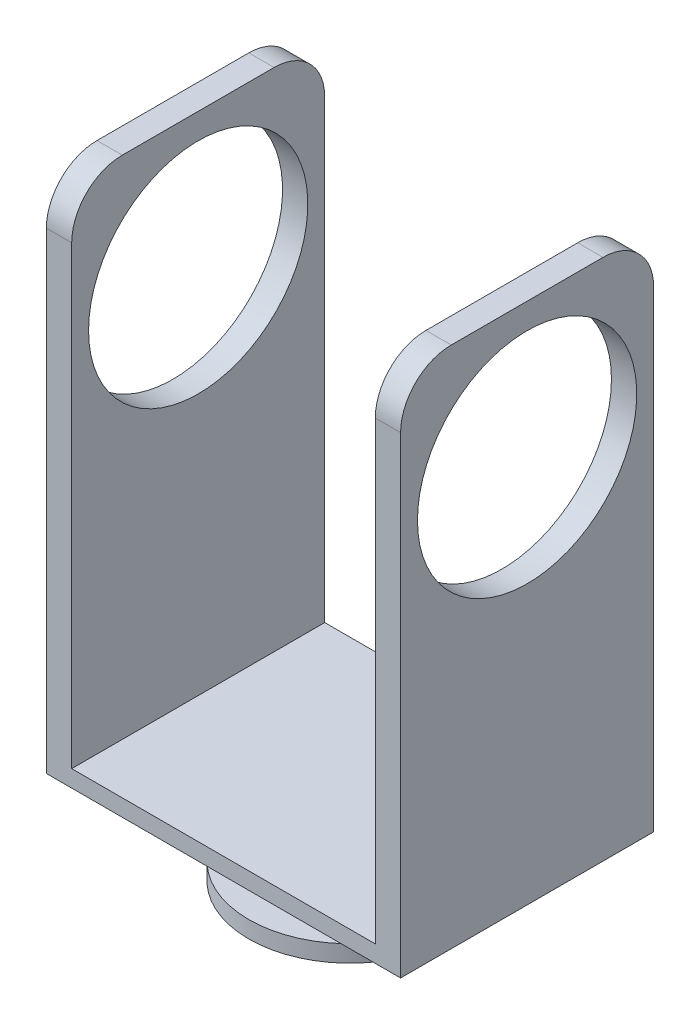
ISO-10303-21;
HEADER;
FILE_DESCRIPTION(('STEP AP214'),'2;1');
FILE_NAME('part.step','',(''),(''),'','','');
FILE_SCHEMA(('AUTOMOTIVE_DESIGN { 1 0 10303 214 1 1 1 1 }'));
ENDSEC;
DATA;
#1=APPLICATION_CONTEXT('core data for automotive mechanical design processes');
#2=APPLICATION_PROTOCOL_DEFINITION('international standard','automotive_design',2000,#1);
#3=PRODUCT_CONTEXT('',#1,'mechanical');
#4=PRODUCT('Part','Part','',(#3));
#5=PRODUCT_RELATED_PRODUCT_CATEGORY('part','',(#4));
#6=PRODUCT_DEFINITION_FORMATION('','',#4);
#7=PRODUCT_DEFINITION_CONTEXT('part definition',#1,'design');
#8=PRODUCT_DEFINITION('design','',#6,#7);
#9=PRODUCT_DEFINITION_SHAPE('','',#8);
#10=(LENGTH_UNIT() NAMED_UNIT(*) SI_UNIT(.MILLI.,.METRE.));
#11=(NAMED_UNIT(*) PLANE_ANGLE_UNIT() SI_UNIT($,.RADIAN.));
#12=(NAMED_UNIT(*) SI_UNIT($,.STERADIAN.) SOLID_ANGLE_UNIT());
#13=UNCERTAINTY_MEASURE_WITH_UNIT(LENGTH_MEASURE(1.E-05),#10,'distance_accuracy_value','');
#14=(GEOMETRIC_REPRESENTATION_CONTEXT(3) GLOBAL_UNCERTAINTY_ASSIGNED_CONTEXT((#13)) GLOBAL_UNIT_ASSIGNED_CONTEXT((#10,
#11,#12)) REPRESENTATION_CONTEXT('',''));
#15=CARTESIAN_POINT('',(0.,0.,0.));
#16=DIRECTION('',(0.,0.,1.));
#17=DIRECTION('',(1.,0.,0.));
#18=AXIS2_PLACEMENT_3D('',#15,#16,#17);
#19=CARTESIAN_POINT('',(0.,5.,0.));
#20=DIRECTION('',(0.,1.,0.));
#21=DIRECTION('',(0.,0.,1.));
#22=AXIS2_PLACEMENT_3D('',#19,#20,#21);
#23=PLANE('',#22);
#24=DIRECTION('',(1.,0.,0.));
#25=VECTOR('',#24,1.);
#26=CARTESIAN_POINT('',(-10.5,5.,7.5));
#27=LINE('',#26,#25);
#28=CARTESIAN_POINT('',(-9.,5.,7.5));
#29=VERTEX_POINT('',#28);
#30=CARTESIAN_POINT('',(9.,5.,7.5));
#31=VERTEX_POINT('',#30);
#32=EDGE_CURVE('E143',#29,#31,#27,.T.);
#33=ORIENTED_EDGE('',*,*,#32,.T.);
#34=DIRECTION('',(0.,0.,1.));
#35=VECTOR('',#34,1.);
#36=CARTESIAN_POINT('',(9.,5.,-7.5));
#37=LINE('',#36,#35);
#38=CARTESIAN_POINT('',(9.,5.,-7.5));
#39=VERTEX_POINT('',#38);
#40=EDGE_CURVE('E142',#39,#31,#37,.T.);
#41=ORIENTED_EDGE('',*,*,#40,.F.);
#42=DIRECTION('',(-1.,0.,0.));
#43=VECTOR('',#42,1.);
#44=CARTESIAN_POINT('',(-10.5,5.,-7.5));
#45=LINE('',#44,#43);
#46=CARTESIAN_POINT('',(-9.00000000000001,5.,-7.5));
#47=VERTEX_POINT('',#46);
#48=EDGE_CURVE('E127',#39,#47,#45,.T.);
#49=ORIENTED_EDGE('',*,*,#48,.T.);
#50=DIRECTION('',(0.,0.,-1.));
#51=VECTOR('',#50,1.);
#52=CARTESIAN_POINT('',(-9.00000000000001,5.,-7.5));
#53=LINE('',#52,#51);
#54=EDGE_CURVE('E139',#29,#47,#53,.T.);
#55=ORIENTED_EDGE('',*,*,#54,.F.);
#56=EDGE_LOOP('',(#33,#41,#49,#55));
#57=FACE_BOUND('',#56,.T.);
#58=ADVANCED_FACE('F33',(#57),#23,.T.);
#59=CARTESIAN_POINT('',(0.,1.,0.));
#60=DIRECTION('',(0.,-1.,0.));
#61=DIRECTION('',(0.,0.,-1.));
#62=AXIS2_PLACEMENT_3D('',#59,#60,#61);
#63=CYLINDRICAL_SURFACE('',#62,6.);
#64=CARTESIAN_POINT('',(0.,1.,0.));
#65=DIRECTION('',(0.,1.,0.));
#66=DIRECTION('',(0.,0.,1.));
#67=AXIS2_PLACEMENT_3D('',#64,#65,#66);
#68=CIRCLE('',#67,6.);
#69=CARTESIAN_POINT('',(0.,1.,6.));
#70=VERTEX_POINT('',#69);
#71=EDGE_CURVE('E185',#70,#70,#68,.T.);
#72=ORIENTED_EDGE('',*,*,#71,.F.);
#73=EDGE_LOOP('',(#72));
#74=FACE_BOUND('',#73,.T.);
#75=CARTESIAN_POINT('',(0.,0.,0.));
#76=DIRECTION('',(0.,1.,0.));
#77=DIRECTION('',(0.,0.,1.));
#78=AXIS2_PLACEMENT_3D('',#75,#76,#77);
#79=CIRCLE('',#78,6.);
#80=CARTESIAN_POINT('',(0.,0.,6.));
#81=VERTEX_POINT('',#80);
#82=EDGE_CURVE('E182',#81,#81,#79,.T.);
#83=ORIENTED_EDGE('',*,*,#82,.T.);
#84=EDGE_LOOP('',(#83));
#85=FACE_BOUND('',#84,.T.);
#86=ADVANCED_FACE('F288',(#74,#85),#63,.T.);
#87=CARTESIAN_POINT('',(0.,1.,0.));
#88=DIRECTION('',(0.,1.,0.));
#89=DIRECTION('',(0.,0.,1.));
#90=AXIS2_PLACEMENT_3D('',#87,#88,#89);
#91=PLANE('',#90);
#92=CARTESIAN_POINT('',(0.,1.,0.));
#93=DIRECTION('',(0.,1.,0.));
#94=DIRECTION('',(0.,0.,1.));
#95=AXIS2_PLACEMENT_3D('',#92,#93,#94);
#96=CIRCLE('',#95,2.5);
#97=CARTESIAN_POINT('',(0.,1.,2.5));
#98=VERTEX_POINT('',#97);
#99=EDGE_CURVE('E178',#98,#98,#96,.T.);
#100=ORIENTED_EDGE('',*,*,#99,.F.);
#101=EDGE_LOOP('',(#100));
#102=FACE_BOUND('',#101,.T.);
#103=ORIENTED_EDGE('',*,*,#71,.T.);
#104=EDGE_LOOP('',(#103));
#105=FACE_BOUND('',#104,.T.);
#106=ADVANCED_FACE('F293',(#102,#105),#91,.T.);
#107=CARTESIAN_POINT('',(0.,0.,0.));
#108=DIRECTION('',(0.,1.,0.));
#109=DIRECTION('',(0.,0.,1.));
#110=AXIS2_PLACEMENT_3D('',#107,#108,#109);
#111=PLANE('',#110);
#112=ORIENTED_EDGE('',*,*,#82,.F.);
#113=EDGE_LOOP('',(#112));
#114=FACE_BOUND('',#113,.T.);
#115=ADVANCED_FACE('F310',(#114),#111,.F.);
#116=CARTESIAN_POINT('',(0.,4.,0.));
#117=DIRECTION('',(0.,-1.,0.));
#118=DIRECTION('',(0.,0.,-1.));
#119=AXIS2_PLACEMENT_3D('',#116,#117,#118);
#120=CYLINDRICAL_SURFACE('',#119,2.5);
#121=CARTESIAN_POINT('',(0.,4.,0.));
#122=DIRECTION('',(0.,1.,0.));
#123=DIRECTION('',(0.,0.,1.));
#124=AXIS2_PLACEMENT_3D('',#121,#122,#123);
#125=CIRCLE('',#124,2.5);
#126=CARTESIAN_POINT('',(0.,4.,2.5));
#127=VERTEX_POINT('',#126);
#128=EDGE_CURVE('E179',#127,#127,#125,.T.);
#129=ORIENTED_EDGE('',*,*,#128,.F.);
#130=EDGE_LOOP('',(#129));
#131=FACE_BOUND('',#130,.T.);
#132=ORIENTED_EDGE('',*,*,#99,.T.);
#133=EDGE_LOOP('',(#132));
#134=FACE_BOUND('',#133,.T.);
#135=ADVANCED_FACE('F307',(#131,#134),#120,.T.);
#136=CARTESIAN_POINT('',(10.5,5.,-7.5));
#137=DIRECTION('',(-1.,0.,0.));
#138=DIRECTION('',(0.,0.,1.));
#139=AXIS2_PLACEMENT_3D('',#136,#137,#138);
#140=PLANE('',#139);
#141=CARTESIAN_POINT('',(10.5,26.9883937853308,0.));
#142=DIRECTION('',(-1.,0.,0.));
#143=DIRECTION('',(0.,0.,1.));
#144=AXIS2_PLACEMENT_3D('',#141,#142,#143);
#145=CIRCLE('',#144,6.5);
#146=CARTESIAN_POINT('',(10.5,26.9883937853308,6.5));
#147=VERTEX_POINT('',#146);
#148=EDGE_CURVE('E265',#147,#147,#145,.T.);
#149=ORIENTED_EDGE('',*,*,#148,.T.);
#150=EDGE_LOOP('',(#149));
#151=FACE_BOUND('',#150,.T.);
#152=DIRECTION('',(0.,0.,-1.));
#153=VECTOR('',#152,1.);
#154=CARTESIAN_POINT('',(10.5,35.,-7.5));
#155=LINE('',#154,#153);
#156=CARTESIAN_POINT('',(10.5,35.,4.5));
#157=VERTEX_POINT('',#156);
#158=CARTESIAN_POINT('',(10.5,35.,-4.5));
#159=VERTEX_POINT('',#158);
#160=EDGE_CURVE('E248',#157,#159,#155,.T.);
#161=ORIENTED_EDGE('',*,*,#160,.F.);
#162=CARTESIAN_POINT('',(10.5,32.,4.5));
#163=DIRECTION('',(-1.,0.,0.));
#164=DIRECTION('',(0.,0.,1.));
#165=AXIS2_PLACEMENT_3D('',#162,#163,#164);
#166=CIRCLE('',#165,3.);
#167=CARTESIAN_POINT('',(10.5,32.,7.5));
#168=VERTEX_POINT('',#167);
#169=EDGE_CURVE('E203',#157,#168,#166,.F.);
#170=ORIENTED_EDGE('',*,*,#169,.T.);
#171=DIRECTION('',(0.,-1.,0.));
#172=VECTOR('',#171,1.);
#173=CARTESIAN_POINT('',(10.5,5.,7.5));
#174=LINE('',#173,#172);
#175=CARTESIAN_POINT('',(10.5,4.,7.5));
#176=VERTEX_POINT('',#175);
#177=EDGE_CURVE('E160',#168,#176,#174,.T.);
#178=ORIENTED_EDGE('',*,*,#177,.T.);
#179=DIRECTION('',(0.,0.,-1.));
#180=VECTOR('',#179,1.);
#181=CARTESIAN_POINT('',(10.5,4.,-7.5));
#182=LINE('',#181,#180);
#183=CARTESIAN_POINT('',(10.5,4.,-7.5));
#184=VERTEX_POINT('',#183);
#185=EDGE_CURVE('E157',#176,#184,#182,.T.);
#186=ORIENTED_EDGE('',*,*,#185,.T.);
#187=DIRECTION('',(0.,-1.,0.));
#188=VECTOR('',#187,1.);
#189=CARTESIAN_POINT('',(10.5,5.,-7.5));
#190=LINE('',#189,#188);
#191=CARTESIAN_POINT('',(10.5,32.,-7.5));
#192=VERTEX_POINT('',#191);
#193=EDGE_CURVE('E176',#192,#184,#190,.T.);
#194=ORIENTED_EDGE('',*,*,#193,.F.);
#195=CARTESIAN_POINT('',(10.5,32.,-4.5));
#196=DIRECTION('',(-1.,0.,0.));
#197=DIRECTION('',(0.,0.,1.));
#198=AXIS2_PLACEMENT_3D('',#195,#196,#197);
#199=CIRCLE('',#198,3.);
#200=EDGE_CURVE('E201',#192,#159,#199,.F.);
#201=ORIENTED_EDGE('',*,*,#200,.T.);
#202=EDGE_LOOP('',(#161,#170,#178,#186,#194,#201));
#203=FACE_BOUND('',#202,.T.);
#204=ADVANCED_FACE('F245',(#151,#203),#140,.F.);
#205=CARTESIAN_POINT('',(-10.5,5.,-7.5));
#206=DIRECTION('',(0.,0.,1.));
#207=DIRECTION('',(1.,0.,0.));
#208=AXIS2_PLACEMENT_3D('',#205,#206,#207);
#209=PLANE('',#208);
#210=DIRECTION('',(0.,-1.,0.));
#211=VECTOR('',#210,1.);
#212=CARTESIAN_POINT('',(9.,35.,-7.5));
#213=LINE('',#212,#211);
#214=CARTESIAN_POINT('',(9.,32.,-7.5));
#215=VERTEX_POINT('',#214);
#216=EDGE_CURVE('E149',#215,#39,#213,.T.);
#217=ORIENTED_EDGE('',*,*,#216,.F.);
#218=DIRECTION('',(-1.,0.,0.));
#219=VECTOR('',#218,1.);
#220=CARTESIAN_POINT('',(-10.5,32.,-7.5));
#221=LINE('',#220,#219);
#222=EDGE_CURVE('E214',#215,#192,#221,.F.);
#223=ORIENTED_EDGE('',*,*,#222,.T.);
#224=ORIENTED_EDGE('',*,*,#193,.T.);
#225=DIRECTION('',(-1.,0.,0.));
#226=VECTOR('',#225,1.);
#227=CARTESIAN_POINT('',(-10.5,4.,-7.5));
#228=LINE('',#227,#226);
#229=CARTESIAN_POINT('',(-10.5,4.,-7.5));
#230=VERTEX_POINT('',#229);
#231=EDGE_CURVE('E163',#184,#230,#228,.T.);
#232=ORIENTED_EDGE('',*,*,#231,.T.);
#233=DIRECTION('',(0.,-1.,0.));
#234=VECTOR('',#233,1.);
#235=CARTESIAN_POINT('',(-10.5,5.,-7.5));
#236=LINE('',#235,#234);
#237=CARTESIAN_POINT('',(-10.5,32.,-7.5));
#238=VERTEX_POINT('',#237);
#239=EDGE_CURVE('E174',#238,#230,#236,.T.);
#240=ORIENTED_EDGE('',*,*,#239,.F.);
#241=DIRECTION('',(-1.,0.,0.));
#242=VECTOR('',#241,1.);
#243=CARTESIAN_POINT('',(-9.00000000000001,32.,-7.5));
#244=LINE('',#243,#242);
#245=CARTESIAN_POINT('',(-9.00000000000001,32.,-7.5));
#246=VERTEX_POINT('',#245);
#247=EDGE_CURVE('E130',#238,#246,#244,.F.);
#248=ORIENTED_EDGE('',*,*,#247,.T.);
#249=DIRECTION('',(0.,-1.,0.));
#250=VECTOR('',#249,1.);
#251=CARTESIAN_POINT('',(-9.00000000000001,35.,-7.5));
#252=LINE('',#251,#250);
#253=EDGE_CURVE('E123',#246,#47,#252,.T.);
#254=ORIENTED_EDGE('',*,*,#253,.T.);
#255=ORIENTED_EDGE('',*,*,#48,.F.);
#256=EDGE_LOOP('',(#217,#223,#224,#232,#240,#248,#254,#255));
#257=FACE_BOUND('',#256,.T.);
#258=ADVANCED_FACE('F126',(#257),#209,.F.);
#259=CARTESIAN_POINT('',(-10.5,5.,-7.5));
#260=DIRECTION('',(1.,0.,0.));
#261=DIRECTION('',(0.,0.,-1.));
#262=AXIS2_PLACEMENT_3D('',#259,#260,#261);
#263=PLANE('',#262);
#264=CARTESIAN_POINT('',(-10.5,26.9883937853308,0.));
#265=DIRECTION('',(-1.,0.,0.));
#266=DIRECTION('',(0.,0.,1.));
#267=AXIS2_PLACEMENT_3D('',#264,#265,#266);
#268=CIRCLE('',#267,6.5);
#269=CARTESIAN_POINT('',(-10.5,26.9883937853308,6.5));
#270=VERTEX_POINT('',#269);
#271=EDGE_CURVE('E195',#270,#270,#268,.T.);
#272=ORIENTED_EDGE('',*,*,#271,.F.);
#273=EDGE_LOOP('',(#272));
#274=FACE_BOUND('',#273,.T.);
#275=DIRECTION('',(0.,-1.,0.));
#276=VECTOR('',#275,1.);
#277=CARTESIAN_POINT('',(-10.5,5.,7.5));
#278=LINE('',#277,#276);
#279=CARTESIAN_POINT('',(-10.5,32.,7.5));
#280=VERTEX_POINT('',#279);
#281=CARTESIAN_POINT('',(-10.5,4.,7.5));
#282=VERTEX_POINT('',#281);
#283=EDGE_CURVE('E172',#280,#282,#278,.T.);
#284=ORIENTED_EDGE('',*,*,#283,.F.);
#285=CARTESIAN_POINT('',(-10.5,32.,4.5));
#286=DIRECTION('',(1.,0.,0.));
#287=DIRECTION('',(0.,0.,-1.));
#288=AXIS2_PLACEMENT_3D('',#285,#286,#287);
#289=CIRCLE('',#288,3.);
#290=CARTESIAN_POINT('',(-10.5,35.,4.5));
#291=VERTEX_POINT('',#290);
#292=EDGE_CURVE('E11',#280,#291,#289,.F.);
#293=ORIENTED_EDGE('',*,*,#292,.T.);
#294=DIRECTION('',(0.,0.,1.));
#295=VECTOR('',#294,1.);
#296=CARTESIAN_POINT('',(-10.5,35.,-7.5));
#297=LINE('',#296,#295);
#298=CARTESIAN_POINT('',(-10.5,35.,-4.5));
#299=VERTEX_POINT('',#298);
#300=EDGE_CURVE('E148',#299,#291,#297,.T.);
#301=ORIENTED_EDGE('',*,*,#300,.F.);
#302=CARTESIAN_POINT('',(-10.5,32.,-4.5));
#303=DIRECTION('',(1.,0.,0.));
#304=DIRECTION('',(0.,0.,-1.));
#305=AXIS2_PLACEMENT_3D('',#302,#303,#304);
#306=CIRCLE('',#305,3.);
#307=EDGE_CURVE('E41',#299,#238,#306,.F.);
#308=ORIENTED_EDGE('',*,*,#307,.T.);
#309=ORIENTED_EDGE('',*,*,#239,.T.);
#310=DIRECTION('',(0.,0.,1.));
#311=VECTOR('',#310,1.);
#312=CARTESIAN_POINT('',(-10.5,4.,-7.5));
#313=LINE('',#312,#311);
#314=EDGE_CURVE('E166',#230,#282,#313,.T.);
#315=ORIENTED_EDGE('',*,*,#314,.T.);
#316=EDGE_LOOP('',(#284,#293,#301,#308,#309,#315));
#317=FACE_BOUND('',#316,.T.);
#318=ADVANCED_FACE('F225',(#274,#317),#263,.F.);
#319=CARTESIAN_POINT('',(-10.5,5.,7.5));
#320=DIRECTION('',(0.,0.,-1.));
#321=DIRECTION('',(-1.,0.,0.));
#322=AXIS2_PLACEMENT_3D('',#319,#320,#321);
#323=PLANE('',#322);
#324=ORIENTED_EDGE('',*,*,#177,.F.);
#325=DIRECTION('',(1.,0.,0.));
#326=VECTOR('',#325,1.);
#327=CARTESIAN_POINT('',(-10.5,32.,7.5));
#328=LINE('',#327,#326);
#329=CARTESIAN_POINT('',(9.00000000000001,32.,7.5));
#330=VERTEX_POINT('',#329);
#331=EDGE_CURVE('E207',#168,#330,#328,.F.);
#332=ORIENTED_EDGE('',*,*,#331,.T.);
#333=DIRECTION('',(0.,-1.,0.));
#334=VECTOR('',#333,1.);
#335=CARTESIAN_POINT('',(9.00000000000001,35.,7.5));
#336=LINE('',#335,#334);
#337=EDGE_CURVE('E153',#330,#31,#336,.T.);
#338=ORIENTED_EDGE('',*,*,#337,.T.);
#339=ORIENTED_EDGE('',*,*,#32,.F.);
#340=DIRECTION('',(0.,-1.,0.));
#341=VECTOR('',#340,1.);
#342=CARTESIAN_POINT('',(-9.,35.,7.5));
#343=LINE('',#342,#341);
#344=CARTESIAN_POINT('',(-9.,32.,7.5));
#345=VERTEX_POINT('',#344);
#346=EDGE_CURVE('E132',#345,#29,#343,.T.);
#347=ORIENTED_EDGE('',*,*,#346,.F.);
#348=DIRECTION('',(1.,0.,0.));
#349=VECTOR('',#348,1.);
#350=CARTESIAN_POINT('',(-10.5,32.,7.5));
#351=LINE('',#350,#349);
#352=EDGE_CURVE('E205',#345,#280,#351,.F.);
#353=ORIENTED_EDGE('',*,*,#352,.T.);
#354=ORIENTED_EDGE('',*,*,#283,.T.);
#355=DIRECTION('',(1.,0.,0.));
#356=VECTOR('',#355,1.);
#357=CARTESIAN_POINT('',(-10.5,4.,7.5));
#358=LINE('',#357,#356);
#359=EDGE_CURVE('E144',#282,#176,#358,.T.);
#360=ORIENTED_EDGE('',*,*,#359,.T.);
#361=EDGE_LOOP('',(#324,#332,#338,#339,#347,#353,#354,#360));
#362=FACE_BOUND('',#361,.T.);
#363=ADVANCED_FACE('F234',(#362),#323,.F.);
#364=CARTESIAN_POINT('',(0.,4.,0.));
#365=DIRECTION('',(0.,1.,0.));
#366=DIRECTION('',(0.,0.,1.));
#367=AXIS2_PLACEMENT_3D('',#364,#365,#366);
#368=PLANE('',#367);
#369=ORIENTED_EDGE('',*,*,#128,.T.);
#370=EDGE_LOOP('',(#369));
#371=FACE_BOUND('',#370,.T.);
#372=ORIENTED_EDGE('',*,*,#185,.F.);
#373=ORIENTED_EDGE('',*,*,#359,.F.);
#374=ORIENTED_EDGE('',*,*,#314,.F.);
#375=ORIENTED_EDGE('',*,*,#231,.F.);
#376=EDGE_LOOP('',(#372,#373,#374,#375));
#377=FACE_BOUND('',#376,.T.);
#378=ADVANCED_FACE('F241',(#371,#377),#368,.F.);
#379=CARTESIAN_POINT('',(-9.00000000000001,35.,-7.5));
#380=DIRECTION('',(-1.,0.,0.));
#381=DIRECTION('',(0.,0.,1.));
#382=AXIS2_PLACEMENT_3D('',#379,#380,#381);
#383=PLANE('',#382);
#384=CARTESIAN_POINT('',(-9.,26.9883937853308,0.));
#385=DIRECTION('',(-1.,0.,0.));
#386=DIRECTION('',(0.,0.,1.));
#387=AXIS2_PLACEMENT_3D('',#384,#385,#386);
#388=CIRCLE('',#387,6.5);
#389=CARTESIAN_POINT('',(-9.,26.9883937853308,6.5));
#390=VERTEX_POINT('',#389);
#391=EDGE_CURVE('E194',#390,#390,#388,.T.);
#392=ORIENTED_EDGE('',*,*,#391,.T.);
#393=EDGE_LOOP('',(#392));
#394=FACE_BOUND('',#393,.T.);
#395=DIRECTION('',(0.,0.,-1.));
#396=VECTOR('',#395,1.);
#397=CARTESIAN_POINT('',(-9.00000000000001,35.,-7.5));
#398=LINE('',#397,#396);
#399=CARTESIAN_POINT('',(-9.,35.,4.5));
#400=VERTEX_POINT('',#399);
#401=CARTESIAN_POINT('',(-9.00000000000001,35.,-4.5));
#402=VERTEX_POINT('',#401);
#403=EDGE_CURVE('E133',#400,#402,#398,.T.);
#404=ORIENTED_EDGE('',*,*,#403,.F.);
#405=CARTESIAN_POINT('',(-9.,32.,4.5));
#406=DIRECTION('',(-1.,0.,0.));
#407=DIRECTION('',(0.,0.,1.));
#408=AXIS2_PLACEMENT_3D('',#405,#406,#407);
#409=CIRCLE('',#408,3.);
#410=EDGE_CURVE('E56',#400,#345,#409,.F.);
#411=ORIENTED_EDGE('',*,*,#410,.T.);
#412=ORIENTED_EDGE('',*,*,#346,.T.);
#413=ORIENTED_EDGE('',*,*,#54,.T.);
#414=ORIENTED_EDGE('',*,*,#253,.F.);
#415=CARTESIAN_POINT('',(-9.00000000000001,32.,-4.5));
#416=DIRECTION('',(-1.,0.,0.));
#417=DIRECTION('',(0.,0.,1.));
#418=AXIS2_PLACEMENT_3D('',#415,#416,#417);
#419=CIRCLE('',#418,3.);
#420=EDGE_CURVE('E48',#246,#402,#419,.F.);
#421=ORIENTED_EDGE('',*,*,#420,.T.);
#422=EDGE_LOOP('',(#404,#411,#412,#413,#414,#421));
#423=FACE_BOUND('',#422,.T.);
#424=ADVANCED_FACE('F146',(#394,#423),#383,.F.);
#425=CARTESIAN_POINT('',(0.,35.,0.));
#426=DIRECTION('',(0.,1.,0.));
#427=DIRECTION('',(0.,0.,1.));
#428=AXIS2_PLACEMENT_3D('',#425,#426,#427);
#429=PLANE('',#428);
#430=ORIENTED_EDGE('',*,*,#300,.T.);
#431=DIRECTION('',(1.,0.,0.));
#432=VECTOR('',#431,1.);
#433=CARTESIAN_POINT('',(-9.,35.,4.5));
#434=LINE('',#433,#432);
#435=EDGE_CURVE('E219',#291,#400,#434,.T.);
#436=ORIENTED_EDGE('',*,*,#435,.T.);
#437=ORIENTED_EDGE('',*,*,#403,.T.);
#438=DIRECTION('',(-1.,0.,0.));
#439=VECTOR('',#438,1.);
#440=CARTESIAN_POINT('',(-10.5,35.,-4.5));
#441=LINE('',#440,#439);
#442=EDGE_CURVE('E216',#402,#299,#441,.T.);
#443=ORIENTED_EDGE('',*,*,#442,.T.);
#444=EDGE_LOOP('',(#430,#436,#437,#443));
#445=FACE_BOUND('',#444,.T.);
#446=ADVANCED_FACE('F231',(#445),#429,.T.);
#447=CARTESIAN_POINT('',(9.,35.,-7.5));
#448=DIRECTION('',(1.,0.,0.));
#449=DIRECTION('',(0.,0.,-1.));
#450=AXIS2_PLACEMENT_3D('',#447,#448,#449);
#451=PLANE('',#450);
#452=CARTESIAN_POINT('',(9.,26.9883937853308,0.));
#453=DIRECTION('',(1.,0.,0.));
#454=DIRECTION('',(0.,0.,-1.));
#455=AXIS2_PLACEMENT_3D('',#452,#453,#454);
#456=CIRCLE('',#455,6.5);
#457=CARTESIAN_POINT('',(9.,26.9883937853308,-6.5));
#458=VERTEX_POINT('',#457);
#459=EDGE_CURVE('E191',#458,#458,#456,.T.);
#460=ORIENTED_EDGE('',*,*,#459,.T.);
#461=EDGE_LOOP('',(#460));
#462=FACE_BOUND('',#461,.T.);
#463=ORIENTED_EDGE('',*,*,#337,.F.);
#464=CARTESIAN_POINT('',(9.00000000000001,32.,4.5));
#465=DIRECTION('',(1.,0.,0.));
#466=DIRECTION('',(0.,0.,-1.));
#467=AXIS2_PLACEMENT_3D('',#464,#465,#466);
#468=CIRCLE('',#467,3.);
#469=CARTESIAN_POINT('',(9.00000000000001,35.,4.5));
#470=VERTEX_POINT('',#469);
#471=EDGE_CURVE('E211',#330,#470,#468,.F.);
#472=ORIENTED_EDGE('',*,*,#471,.T.);
#473=DIRECTION('',(0.,0.,1.));
#474=VECTOR('',#473,1.);
#475=CARTESIAN_POINT('',(9.,35.,-7.5));
#476=LINE('',#475,#474);
#477=CARTESIAN_POINT('',(9.,35.,-4.5));
#478=VERTEX_POINT('',#477);
#479=EDGE_CURVE('E258',#478,#470,#476,.T.);
#480=ORIENTED_EDGE('',*,*,#479,.F.);
#481=CARTESIAN_POINT('',(9.,32.,-4.5));
#482=DIRECTION('',(1.,0.,0.));
#483=DIRECTION('',(0.,0.,-1.));
#484=AXIS2_PLACEMENT_3D('',#481,#482,#483);
#485=CIRCLE('',#484,3.);
#486=EDGE_CURVE('E209',#478,#215,#485,.F.);
#487=ORIENTED_EDGE('',*,*,#486,.T.);
#488=ORIENTED_EDGE('',*,*,#216,.T.);
#489=ORIENTED_EDGE('',*,*,#40,.T.);
#490=EDGE_LOOP('',(#463,#472,#480,#487,#488,#489));
#491=FACE_BOUND('',#490,.T.);
#492=ADVANCED_FACE('F365',(#462,#491),#451,.F.);
#493=CARTESIAN_POINT('',(0.,35.,0.));
#494=DIRECTION('',(0.,-1.,0.));
#495=DIRECTION('',(0.,0.,-1.));
#496=AXIS2_PLACEMENT_3D('',#493,#494,#495);
#497=PLANE('',#496);
#498=ORIENTED_EDGE('',*,*,#479,.T.);
#499=DIRECTION('',(1.,0.,0.));
#500=VECTOR('',#499,1.);
#501=CARTESIAN_POINT('',(0.,35.,4.5));
#502=LINE('',#501,#500);
#503=EDGE_CURVE('E198',#470,#157,#502,.T.);
#504=ORIENTED_EDGE('',*,*,#503,.T.);
#505=ORIENTED_EDGE('',*,*,#160,.T.);
#506=DIRECTION('',(-1.,0.,0.));
#507=VECTOR('',#506,1.);
#508=CARTESIAN_POINT('',(0.,35.,-4.5));
#509=LINE('',#508,#507);
#510=EDGE_CURVE('E188',#159,#478,#509,.T.);
#511=ORIENTED_EDGE('',*,*,#510,.T.);
#512=EDGE_LOOP('',(#498,#504,#505,#511));
#513=FACE_BOUND('',#512,.T.);
#514=ADVANCED_FACE('F255',(#513),#497,.F.);
#515=CARTESIAN_POINT('',(23.5,26.9883937853308,0.));
#516=DIRECTION('',(-1.,0.,0.));
#517=DIRECTION('',(0.,0.,1.));
#518=AXIS2_PLACEMENT_3D('',#515,#516,#517);
#519=CYLINDRICAL_SURFACE('',#518,6.5);
#520=ORIENTED_EDGE('',*,*,#459,.F.);
#521=EDGE_LOOP('',(#520));
#522=FACE_BOUND('',#521,.T.);
#523=ORIENTED_EDGE('',*,*,#148,.F.);
#524=EDGE_LOOP('',(#523));
#525=FACE_BOUND('',#524,.T.);
#526=ADVANCED_FACE('F364',(#522,#525),#519,.F.);
#527=ORIENTED_EDGE('',*,*,#271,.T.);
#528=EDGE_LOOP('',(#527));
#529=FACE_BOUND('',#528,.T.);
#530=ORIENTED_EDGE('',*,*,#391,.F.);
#531=EDGE_LOOP('',(#530));
#532=FACE_BOUND('',#531,.T.);
#533=ADVANCED_FACE('F276',(#529,#532),#519,.F.);
#534=CARTESIAN_POINT('',(0.,32.,4.5));
#535=DIRECTION('',(1.,0.,0.));
#536=DIRECTION('',(0.,0.,-1.));
#537=AXIS2_PLACEMENT_3D('',#534,#535,#536);
#538=CYLINDRICAL_SURFACE('',#537,3.);
#539=ORIENTED_EDGE('',*,*,#471,.F.);
#540=ORIENTED_EDGE('',*,*,#331,.F.);
#541=ORIENTED_EDGE('',*,*,#169,.F.);
#542=ORIENTED_EDGE('',*,*,#503,.F.);
#543=EDGE_LOOP('',(#539,#540,#541,#542));
#544=FACE_BOUND('',#543,.T.);
#545=ADVANCED_FACE('F252',(#544),#538,.T.);
#546=CARTESIAN_POINT('',(0.,32.,-4.5));
#547=DIRECTION('',(-1.,0.,0.));
#548=DIRECTION('',(0.,0.,1.));
#549=AXIS2_PLACEMENT_3D('',#546,#547,#548);
#550=CYLINDRICAL_SURFACE('',#549,3.);
#551=ORIENTED_EDGE('',*,*,#200,.F.);
#552=ORIENTED_EDGE('',*,*,#222,.F.);
#553=ORIENTED_EDGE('',*,*,#486,.F.);
#554=ORIENTED_EDGE('',*,*,#510,.F.);
#555=EDGE_LOOP('',(#551,#552,#553,#554));
#556=FACE_BOUND('',#555,.T.);
#557=ADVANCED_FACE('F328',(#556),#550,.T.);
#558=CARTESIAN_POINT('',(0.,32.,4.5));
#559=DIRECTION('',(-1.,0.,0.));
#560=DIRECTION('',(0.,0.,1.));
#561=AXIS2_PLACEMENT_3D('',#558,#559,#560);
#562=CYLINDRICAL_SURFACE('',#561,3.);
#563=ORIENTED_EDGE('',*,*,#292,.F.);
#564=ORIENTED_EDGE('',*,*,#352,.F.);
#565=ORIENTED_EDGE('',*,*,#410,.F.);
#566=ORIENTED_EDGE('',*,*,#435,.F.);
#567=EDGE_LOOP('',(#563,#564,#565,#566));
#568=FACE_BOUND('',#567,.T.);
#569=ADVANCED_FACE('F236',(#568),#562,.T.);
#570=CARTESIAN_POINT('',(0.,32.,-4.5));
#571=DIRECTION('',(1.,0.,0.));
#572=DIRECTION('',(0.,0.,-1.));
#573=AXIS2_PLACEMENT_3D('',#570,#571,#572);
#574=CYLINDRICAL_SURFACE('',#573,3.);
#575=ORIENTED_EDGE('',*,*,#420,.F.);
#576=ORIENTED_EDGE('',*,*,#247,.F.);
#577=ORIENTED_EDGE('',*,*,#307,.F.);
#578=ORIENTED_EDGE('',*,*,#442,.F.);
#579=EDGE_LOOP('',(#575,#576,#577,#578));
#580=FACE_BOUND('',#579,.T.);
#581=ADVANCED_FACE('F35',(#580),#574,.T.);
#582=CLOSED_SHELL('',(#58,#86,#106,#115,#135,#204,#258,#318,#363,#378,#424,#446,#492,#514,#526,
#533,#545,#557,#569,#581));
#583=MANIFOLD_SOLID_BREP('B2',#582);
#584=ADVANCED_BREP_SHAPE_REPRESENTATION('',(#18,#583),#14);
#585=SHAPE_DEFINITION_REPRESENTATION(#9,#584);
ENDSEC;
END-ISO-10303-21;
